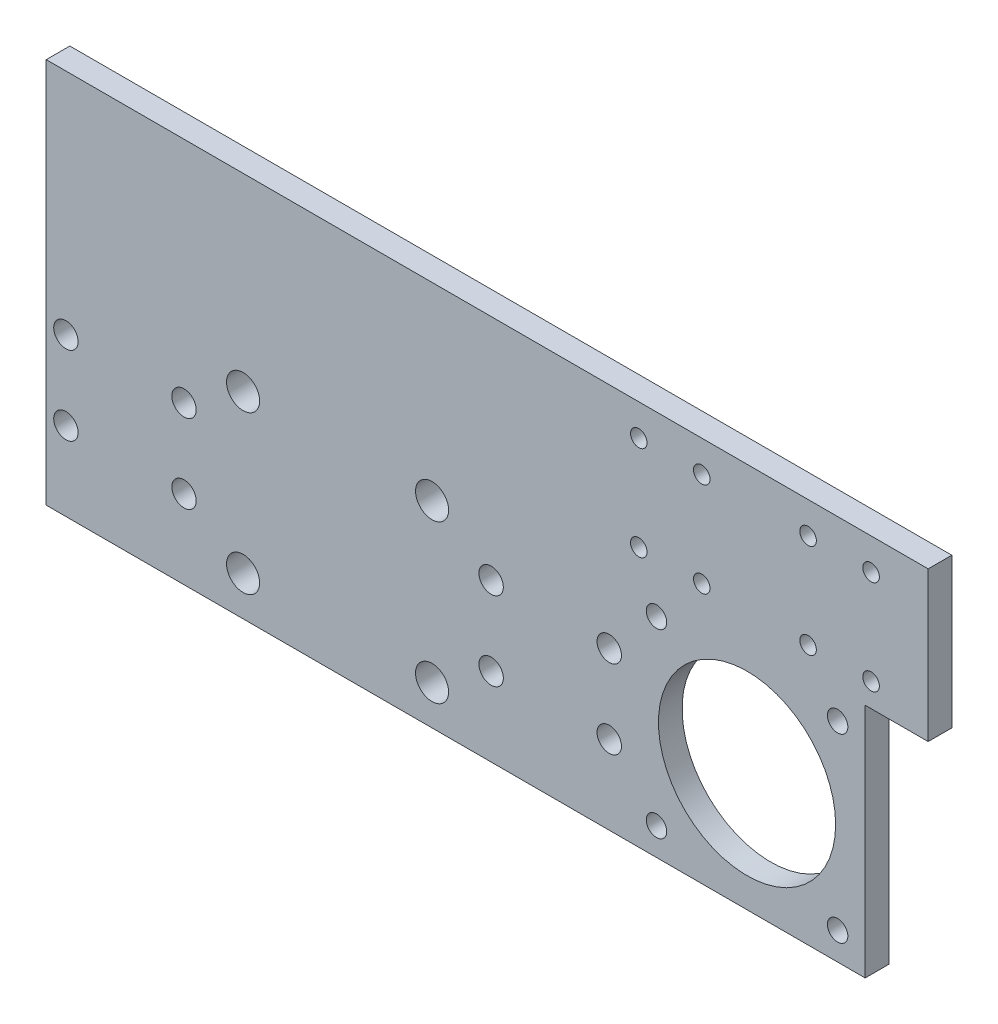
ISO-10303-21;
HEADER;
FILE_DESCRIPTION(('STEP AP214'),'2;1');
FILE_NAME('part.step','',(''),(''),'','','');
FILE_SCHEMA(('AUTOMOTIVE_DESIGN { 1 0 10303 214 1 1 1 1 }'));
ENDSEC;
DATA;
#1=APPLICATION_CONTEXT('core data for automotive mechanical design processes');
#2=APPLICATION_PROTOCOL_DEFINITION('international standard','automotive_design',2000,#1);
#3=PRODUCT_CONTEXT('',#1,'mechanical');
#4=PRODUCT('Part','Part','',(#3));
#5=PRODUCT_RELATED_PRODUCT_CATEGORY('part','',(#4));
#6=PRODUCT_DEFINITION_FORMATION('','',#4);
#7=PRODUCT_DEFINITION_CONTEXT('part definition',#1,'design');
#8=PRODUCT_DEFINITION('design','',#6,#7);
#9=PRODUCT_DEFINITION_SHAPE('','',#8);
#10=(LENGTH_UNIT() NAMED_UNIT(*) SI_UNIT(.MILLI.,.METRE.));
#11=(NAMED_UNIT(*) PLANE_ANGLE_UNIT() SI_UNIT($,.RADIAN.));
#12=(NAMED_UNIT(*) SI_UNIT($,.STERADIAN.) SOLID_ANGLE_UNIT());
#13=UNCERTAINTY_MEASURE_WITH_UNIT(LENGTH_MEASURE(1.E-05),#10,'distance_accuracy_value','');
#14=(GEOMETRIC_REPRESENTATION_CONTEXT(3) GLOBAL_UNCERTAINTY_ASSIGNED_CONTEXT((#13)) GLOBAL_UNIT_ASSIGNED_CONTEXT((#10,
#11,#12)) REPRESENTATION_CONTEXT('',''));
#15=CARTESIAN_POINT('',(0.,0.,0.));
#16=DIRECTION('',(0.,0.,1.));
#17=DIRECTION('',(1.,0.,0.));
#18=AXIS2_PLACEMENT_3D('',#15,#16,#17);
#19=CARTESIAN_POINT('',(-37.,15.,3.));
#20=DIRECTION('',(1.,0.,0.));
#21=DIRECTION('',(0.,1.,0.));
#22=AXIS2_PLACEMENT_3D('',#19,#20,#21);
#23=PLANE('',#22);
#24=DIRECTION('',(0.,-1.,0.));
#25=VECTOR('',#24,1.);
#26=CARTESIAN_POINT('',(-37.,15.,0.));
#27=LINE('',#26,#25);
#28=CARTESIAN_POINT('',(-37.,34.,0.));
#29=VERTEX_POINT('',#28);
#30=CARTESIAN_POINT('',(-37.,-15.,0.));
#31=VERTEX_POINT('',#30);
#32=EDGE_CURVE('E285',#29,#31,#27,.T.);
#33=ORIENTED_EDGE('',*,*,#32,.T.);
#34=DIRECTION('',(0.,0.,-1.));
#35=VECTOR('',#34,1.);
#36=CARTESIAN_POINT('',(-37.,-15.,3.));
#37=LINE('',#36,#35);
#38=CARTESIAN_POINT('',(-37.,-15.,3.));
#39=VERTEX_POINT('',#38);
#40=EDGE_CURVE('E11',#39,#31,#37,.T.);
#41=ORIENTED_EDGE('',*,*,#40,.F.);
#42=DIRECTION('',(0.,-1.,0.));
#43=VECTOR('',#42,1.);
#44=CARTESIAN_POINT('',(-37.,15.,3.));
#45=LINE('',#44,#43);
#46=CARTESIAN_POINT('',(-37.,34.,3.));
#47=VERTEX_POINT('',#46);
#48=EDGE_CURVE('E65',#47,#39,#45,.T.);
#49=ORIENTED_EDGE('',*,*,#48,.F.);
#50=DIRECTION('',(0.,0.,1.));
#51=VECTOR('',#50,1.);
#52=CARTESIAN_POINT('',(-37.,34.,0.));
#53=LINE('',#52,#51);
#54=EDGE_CURVE('E101',#29,#47,#53,.T.);
#55=ORIENTED_EDGE('',*,*,#54,.F.);
#56=EDGE_LOOP('',(#33,#41,#49,#55));
#57=FACE_BOUND('',#56,.T.);
#58=ADVANCED_FACE('F39',(#57),#23,.F.);
#59=CARTESIAN_POINT('',(-37.,-15.,3.));
#60=DIRECTION('',(0.,1.,0.));
#61=DIRECTION('',(0.,0.,1.));
#62=AXIS2_PLACEMENT_3D('',#59,#60,#61);
#63=PLANE('',#62);
#64=DIRECTION('',(1.,0.,0.));
#65=VECTOR('',#64,1.);
#66=CARTESIAN_POINT('',(-37.,-15.,0.));
#67=LINE('',#66,#65);
#68=CARTESIAN_POINT('',(67.,-15.,0.));
#69=VERTEX_POINT('',#68);
#70=EDGE_CURVE('E291',#31,#69,#67,.T.);
#71=ORIENTED_EDGE('',*,*,#70,.T.);
#72=DIRECTION('',(0.,0.,1.));
#73=VECTOR('',#72,1.);
#74=CARTESIAN_POINT('',(67.,-15.,0.));
#75=LINE('',#74,#73);
#76=CARTESIAN_POINT('',(67.,-15.,3.));
#77=VERTEX_POINT('',#76);
#78=EDGE_CURVE('E186',#69,#77,#75,.T.);
#79=ORIENTED_EDGE('',*,*,#78,.T.);
#80=DIRECTION('',(1.,0.,0.));
#81=VECTOR('',#80,1.);
#82=CARTESIAN_POINT('',(-37.,-15.,3.));
#83=LINE('',#82,#81);
#84=EDGE_CURVE('E48',#39,#77,#83,.T.);
#85=ORIENTED_EDGE('',*,*,#84,.F.);
#86=ORIENTED_EDGE('',*,*,#40,.T.);
#87=EDGE_LOOP('',(#71,#79,#85,#86));
#88=FACE_BOUND('',#87,.T.);
#89=ADVANCED_FACE('F336',(#88),#63,.F.);
#90=CARTESIAN_POINT('',(0.,0.,3.));
#91=DIRECTION('',(0.,0.,1.));
#92=DIRECTION('',(1.,0.,0.));
#93=AXIS2_PLACEMENT_3D('',#90,#91,#92);
#94=PLANE('',#93);
#95=CARTESIAN_POINT('',(38.25,30.,3.));
#96=DIRECTION('',(0.,0.,1.));
#97=DIRECTION('',(1.,0.,0.));
#98=AXIS2_PLACEMENT_3D('',#95,#96,#97);
#99=CIRCLE('',#98,1.05);
#100=CARTESIAN_POINT('',(39.3,30.,3.));
#101=VERTEX_POINT('',#100);
#102=EDGE_CURVE('E523',#101,#101,#99,.T.);
#103=ORIENTED_EDGE('',*,*,#102,.F.);
#104=EDGE_LOOP('',(#103));
#105=FACE_BOUND('',#104,.T.);
#106=CARTESIAN_POINT('',(38.25,18.,3.));
#107=DIRECTION('',(0.,0.,1.));
#108=DIRECTION('',(1.,0.,0.));
#109=AXIS2_PLACEMENT_3D('',#106,#107,#108);
#110=CIRCLE('',#109,1.05);
#111=CARTESIAN_POINT('',(39.3,18.,3.));
#112=VERTEX_POINT('',#111);
#113=EDGE_CURVE('E515',#112,#112,#110,.T.);
#114=ORIENTED_EDGE('',*,*,#113,.F.);
#115=EDGE_LOOP('',(#114));
#116=FACE_BOUND('',#115,.T.);
#117=CARTESIAN_POINT('',(46.25,18.,3.));
#118=DIRECTION('',(0.,0.,1.));
#119=DIRECTION('',(1.,0.,0.));
#120=AXIS2_PLACEMENT_3D('',#117,#118,#119);
#121=CIRCLE('',#120,1.05);
#122=CARTESIAN_POINT('',(47.3,18.,3.));
#123=VERTEX_POINT('',#122);
#124=EDGE_CURVE('E459',#123,#123,#121,.T.);
#125=ORIENTED_EDGE('',*,*,#124,.F.);
#126=EDGE_LOOP('',(#125));
#127=FACE_BOUND('',#126,.T.);
#128=CARTESIAN_POINT('',(46.25,30.,3.));
#129=DIRECTION('',(0.,0.,1.));
#130=DIRECTION('',(1.,0.,0.));
#131=AXIS2_PLACEMENT_3D('',#128,#129,#130);
#132=CIRCLE('',#131,1.05);
#133=CARTESIAN_POINT('',(47.3,30.,3.));
#134=VERTEX_POINT('',#133);
#135=EDGE_CURVE('E458',#134,#134,#132,.T.);
#136=ORIENTED_EDGE('',*,*,#135,.F.);
#137=EDGE_LOOP('',(#136));
#138=FACE_BOUND('',#137,.T.);
#139=ORIENTED_EDGE('',*,*,#48,.T.);
#140=ORIENTED_EDGE('',*,*,#84,.T.);
#141=DIRECTION('',(0.,1.,0.));
#142=VECTOR('',#141,1.);
#143=CARTESIAN_POINT('',(67.,15.,3.));
#144=LINE('',#143,#142);
#145=CARTESIAN_POINT('',(67.,15.,3.));
#146=VERTEX_POINT('',#145);
#147=EDGE_CURVE('E179',#77,#146,#144,.T.);
#148=ORIENTED_EDGE('',*,*,#147,.T.);
#149=DIRECTION('',(-1.,0.,0.));
#150=VECTOR('',#149,1.);
#151=CARTESIAN_POINT('',(67.,15.,3.));
#152=LINE('',#151,#150);
#153=CARTESIAN_POINT('',(75.,15.,3.));
#154=VERTEX_POINT('',#153);
#155=EDGE_CURVE('E115',#154,#146,#152,.T.);
#156=ORIENTED_EDGE('',*,*,#155,.F.);
#157=DIRECTION('',(0.,-1.,0.));
#158=VECTOR('',#157,1.);
#159=CARTESIAN_POINT('',(75.,34.,3.));
#160=LINE('',#159,#158);
#161=CARTESIAN_POINT('',(75.,34.,3.));
#162=VERTEX_POINT('',#161);
#163=EDGE_CURVE('E109',#162,#154,#160,.T.);
#164=ORIENTED_EDGE('',*,*,#163,.F.);
#165=DIRECTION('',(-1.,0.,0.));
#166=VECTOR('',#165,1.);
#167=CARTESIAN_POINT('',(-37.,34.,3.));
#168=LINE('',#167,#166);
#169=EDGE_CURVE('E95',#162,#47,#168,.T.);
#170=ORIENTED_EDGE('',*,*,#169,.T.);
#171=EDGE_LOOP('',(#139,#140,#148,#156,#164,#170));
#172=FACE_BOUND('',#171,.T.);
#173=CARTESIAN_POINT('',(51.9999999999998,0.,3.));
#174=DIRECTION('',(0.,0.,1.));
#175=DIRECTION('',(1.,0.,0.));
#176=AXIS2_PLACEMENT_3D('',#173,#174,#175);
#177=CIRCLE('',#176,11.25);
#178=CARTESIAN_POINT('',(63.2499999999998,0.,3.));
#179=VERTEX_POINT('',#178);
#180=EDGE_CURVE('E171',#179,#179,#177,.T.);
#181=ORIENTED_EDGE('',*,*,#180,.F.);
#182=EDGE_LOOP('',(#181));
#183=FACE_BOUND('',#182,.T.);
#184=CARTESIAN_POINT('',(40.4999999999998,11.5,3.));
#185=DIRECTION('',(0.,0.,1.));
#186=DIRECTION('',(1.,0.,0.));
#187=AXIS2_PLACEMENT_3D('',#184,#185,#186);
#188=CIRCLE('',#187,1.3);
#189=CARTESIAN_POINT('',(41.7999999999998,11.5,3.));
#190=VERTEX_POINT('',#189);
#191=EDGE_CURVE('E163',#190,#190,#188,.T.);
#192=ORIENTED_EDGE('',*,*,#191,.F.);
#193=EDGE_LOOP('',(#192));
#194=FACE_BOUND('',#193,.T.);
#195=CARTESIAN_POINT('',(63.4999999999998,11.5,3.));
#196=DIRECTION('',(0.,0.,1.));
#197=DIRECTION('',(1.,0.,0.));
#198=AXIS2_PLACEMENT_3D('',#195,#196,#197);
#199=CIRCLE('',#198,1.29999999999999);
#200=CARTESIAN_POINT('',(64.7999999999998,11.5,3.));
#201=VERTEX_POINT('',#200);
#202=EDGE_CURVE('E155',#201,#201,#199,.T.);
#203=ORIENTED_EDGE('',*,*,#202,.F.);
#204=EDGE_LOOP('',(#203));
#205=FACE_BOUND('',#204,.T.);
#206=CARTESIAN_POINT('',(40.4999999999998,-11.5,3.));
#207=DIRECTION('',(0.,0.,1.));
#208=DIRECTION('',(1.,0.,0.));
#209=AXIS2_PLACEMENT_3D('',#206,#207,#208);
#210=CIRCLE('',#209,1.3);
#211=CARTESIAN_POINT('',(41.7999999999998,-11.5,3.));
#212=VERTEX_POINT('',#211);
#213=EDGE_CURVE('E147',#212,#212,#210,.T.);
#214=ORIENTED_EDGE('',*,*,#213,.F.);
#215=EDGE_LOOP('',(#214));
#216=FACE_BOUND('',#215,.T.);
#217=CARTESIAN_POINT('',(63.4999999999998,-11.5,3.));
#218=DIRECTION('',(0.,0.,1.));
#219=DIRECTION('',(1.,0.,0.));
#220=AXIS2_PLACEMENT_3D('',#217,#218,#219);
#221=CIRCLE('',#220,1.29999999999999);
#222=CARTESIAN_POINT('',(64.7999999999998,-11.5,3.));
#223=VERTEX_POINT('',#222);
#224=EDGE_CURVE('E142',#223,#223,#221,.T.);
#225=ORIENTED_EDGE('',*,*,#224,.F.);
#226=EDGE_LOOP('',(#225));
#227=FACE_BOUND('',#226,.T.);
#228=CARTESIAN_POINT('',(34.5,5.00000000000001,3.));
#229=DIRECTION('',(0.,0.,-1.));
#230=DIRECTION('',(-1.,0.,0.));
#231=AXIS2_PLACEMENT_3D('',#228,#229,#230);
#232=CIRCLE('',#231,1.55);
#233=CARTESIAN_POINT('',(32.95,5.00000000000001,3.));
#234=VERTEX_POINT('',#233);
#235=EDGE_CURVE('E281',#234,#234,#232,.T.);
#236=ORIENTED_EDGE('',*,*,#235,.T.);
#237=EDGE_LOOP('',(#236));
#238=FACE_BOUND('',#237,.T.);
#239=CARTESIAN_POINT('',(-34.5,-4.99999999999996,3.));
#240=DIRECTION('',(0.,0.,-1.));
#241=DIRECTION('',(-1.,0.,0.));
#242=AXIS2_PLACEMENT_3D('',#239,#240,#241);
#243=CIRCLE('',#242,1.55);
#244=CARTESIAN_POINT('',(-36.05,-4.99999999999996,3.));
#245=VERTEX_POINT('',#244);
#246=EDGE_CURVE('E201',#245,#245,#243,.T.);
#247=ORIENTED_EDGE('',*,*,#246,.T.);
#248=EDGE_LOOP('',(#247));
#249=FACE_BOUND('',#248,.T.);
#250=CARTESIAN_POINT('',(-19.5,5.00000000000004,3.));
#251=DIRECTION('',(0.,0.,-1.));
#252=DIRECTION('',(-1.,0.,0.));
#253=AXIS2_PLACEMENT_3D('',#250,#251,#252);
#254=CIRCLE('',#253,1.55);
#255=CARTESIAN_POINT('',(-21.05,5.00000000000004,3.));
#256=VERTEX_POINT('',#255);
#257=EDGE_CURVE('E210',#256,#256,#254,.T.);
#258=ORIENTED_EDGE('',*,*,#257,.T.);
#259=EDGE_LOOP('',(#258));
#260=FACE_BOUND('',#259,.T.);
#261=CARTESIAN_POINT('',(-19.5,-4.99999999999996,3.));
#262=DIRECTION('',(0.,0.,-1.));
#263=DIRECTION('',(-1.,0.,0.));
#264=AXIS2_PLACEMENT_3D('',#261,#262,#263);
#265=CIRCLE('',#264,1.55);
#266=CARTESIAN_POINT('',(-21.05,-4.99999999999996,3.));
#267=VERTEX_POINT('',#266);
#268=EDGE_CURVE('E193',#267,#267,#265,.T.);
#269=ORIENTED_EDGE('',*,*,#268,.T.);
#270=EDGE_LOOP('',(#269));
#271=FACE_BOUND('',#270,.T.);
#272=CARTESIAN_POINT('',(12.,10.,3.));
#273=DIRECTION('',(0.,0.,-1.));
#274=DIRECTION('',(-1.,0.,0.));
#275=AXIS2_PLACEMENT_3D('',#272,#273,#274);
#276=CIRCLE('',#275,2.1);
#277=CARTESIAN_POINT('',(9.90000000000003,10.,3.));
#278=VERTEX_POINT('',#277);
#279=EDGE_CURVE('E258',#278,#278,#276,.T.);
#280=ORIENTED_EDGE('',*,*,#279,.T.);
#281=EDGE_LOOP('',(#280));
#282=FACE_BOUND('',#281,.T.);
#283=CARTESIAN_POINT('',(19.5,-4.99999999999999,3.));
#284=DIRECTION('',(0.,0.,-1.));
#285=DIRECTION('',(-1.,0.,0.));
#286=AXIS2_PLACEMENT_3D('',#283,#284,#285);
#287=CIRCLE('',#286,1.55);
#288=CARTESIAN_POINT('',(17.95,-4.99999999999999,3.));
#289=VERTEX_POINT('',#288);
#290=EDGE_CURVE('E249',#289,#289,#287,.T.);
#291=ORIENTED_EDGE('',*,*,#290,.T.);
#292=EDGE_LOOP('',(#291));
#293=FACE_BOUND('',#292,.T.);
#294=CARTESIAN_POINT('',(19.5,5.00000000000001,3.));
#295=DIRECTION('',(0.,0.,-1.));
#296=DIRECTION('',(-1.,0.,0.));
#297=AXIS2_PLACEMENT_3D('',#294,#295,#296);
#298=CIRCLE('',#297,1.55);
#299=CARTESIAN_POINT('',(17.95,5.00000000000001,3.));
#300=VERTEX_POINT('',#299);
#301=EDGE_CURVE('E274',#300,#300,#298,.T.);
#302=ORIENTED_EDGE('',*,*,#301,.T.);
#303=EDGE_LOOP('',(#302));
#304=FACE_BOUND('',#303,.T.);
#305=CARTESIAN_POINT('',(34.5,-4.99999999999999,3.));
#306=DIRECTION('',(0.,0.,-1.));
#307=DIRECTION('',(-1.,0.,0.));
#308=AXIS2_PLACEMENT_3D('',#305,#306,#307);
#309=CIRCLE('',#308,1.55);
#310=CARTESIAN_POINT('',(32.95,-4.99999999999999,3.));
#311=VERTEX_POINT('',#310);
#312=EDGE_CURVE('E265',#311,#311,#309,.T.);
#313=ORIENTED_EDGE('',*,*,#312,.T.);
#314=EDGE_LOOP('',(#313));
#315=FACE_BOUND('',#314,.T.);
#316=CARTESIAN_POINT('',(-34.5,5.00000000000004,3.));
#317=DIRECTION('',(0.,0.,-1.));
#318=DIRECTION('',(-1.,0.,0.));
#319=AXIS2_PLACEMENT_3D('',#316,#317,#318);
#320=CIRCLE('',#319,1.55);
#321=CARTESIAN_POINT('',(-36.05,5.00000000000004,3.));
#322=VERTEX_POINT('',#321);
#323=EDGE_CURVE('E226',#322,#322,#320,.T.);
#324=ORIENTED_EDGE('',*,*,#323,.T.);
#325=EDGE_LOOP('',(#324));
#326=FACE_BOUND('',#325,.T.);
#327=CARTESIAN_POINT('',(-12.,-9.99999999999997,3.));
#328=DIRECTION('',(0.,0.,-1.));
#329=DIRECTION('',(-1.,0.,0.));
#330=AXIS2_PLACEMENT_3D('',#327,#328,#329);
#331=CIRCLE('',#330,2.1);
#332=CARTESIAN_POINT('',(-14.1,-9.99999999999997,3.));
#333=VERTEX_POINT('',#332);
#334=EDGE_CURVE('E217',#333,#333,#331,.T.);
#335=ORIENTED_EDGE('',*,*,#334,.T.);
#336=EDGE_LOOP('',(#335));
#337=FACE_BOUND('',#336,.T.);
#338=CARTESIAN_POINT('',(12.,-9.99999999999997,3.));
#339=DIRECTION('',(0.,0.,-1.));
#340=DIRECTION('',(-1.,0.,0.));
#341=AXIS2_PLACEMENT_3D('',#338,#339,#340);
#342=CIRCLE('',#341,2.1);
#343=CARTESIAN_POINT('',(9.90000000000003,-9.99999999999997,3.));
#344=VERTEX_POINT('',#343);
#345=EDGE_CURVE('E242',#344,#344,#342,.T.);
#346=ORIENTED_EDGE('',*,*,#345,.T.);
#347=EDGE_LOOP('',(#346));
#348=FACE_BOUND('',#347,.T.);
#349=CARTESIAN_POINT('',(-12.,10.,3.));
#350=DIRECTION('',(0.,0.,-1.));
#351=DIRECTION('',(-1.,0.,0.));
#352=AXIS2_PLACEMENT_3D('',#349,#350,#351);
#353=CIRCLE('',#352,2.1);
#354=CARTESIAN_POINT('',(-14.1,10.,3.));
#355=VERTEX_POINT('',#354);
#356=EDGE_CURVE('E233',#355,#355,#353,.T.);
#357=ORIENTED_EDGE('',*,*,#356,.T.);
#358=EDGE_LOOP('',(#357));
#359=FACE_BOUND('',#358,.T.);
#360=CARTESIAN_POINT('',(59.75,30.,3.));
#361=DIRECTION('',(0.,0.,1.));
#362=DIRECTION('',(1.,0.,0.));
#363=AXIS2_PLACEMENT_3D('',#360,#361,#362);
#364=CIRCLE('',#363,1.05);
#365=CARTESIAN_POINT('',(60.8,30.,3.));
#366=VERTEX_POINT('',#365);
#367=EDGE_CURVE('E129',#366,#366,#364,.T.);
#368=ORIENTED_EDGE('',*,*,#367,.F.);
#369=EDGE_LOOP('',(#368));
#370=FACE_BOUND('',#369,.T.);
#371=CARTESIAN_POINT('',(67.75,18.,3.));
#372=DIRECTION('',(0.,0.,1.));
#373=DIRECTION('',(1.,0.,0.));
#374=AXIS2_PLACEMENT_3D('',#371,#372,#373);
#375=CIRCLE('',#374,1.05000000000001);
#376=CARTESIAN_POINT('',(68.8,18.,3.));
#377=VERTEX_POINT('',#376);
#378=EDGE_CURVE('E464',#377,#377,#375,.T.);
#379=ORIENTED_EDGE('',*,*,#378,.F.);
#380=EDGE_LOOP('',(#379));
#381=FACE_BOUND('',#380,.T.);
#382=CARTESIAN_POINT('',(59.75,18.,3.));
#383=DIRECTION('',(0.,0.,1.));
#384=DIRECTION('',(1.,0.,0.));
#385=AXIS2_PLACEMENT_3D('',#382,#383,#384);
#386=CIRCLE('',#385,1.05);
#387=CARTESIAN_POINT('',(60.8,18.,3.));
#388=VERTEX_POINT('',#387);
#389=EDGE_CURVE('E473',#388,#388,#386,.T.);
#390=ORIENTED_EDGE('',*,*,#389,.F.);
#391=EDGE_LOOP('',(#390));
#392=FACE_BOUND('',#391,.T.);
#393=CARTESIAN_POINT('',(67.75,30.,3.));
#394=DIRECTION('',(0.,0.,1.));
#395=DIRECTION('',(1.,0.,0.));
#396=AXIS2_PLACEMENT_3D('',#393,#394,#395);
#397=CIRCLE('',#396,1.05000000000001);
#398=CARTESIAN_POINT('',(68.8,30.,3.));
#399=VERTEX_POINT('',#398);
#400=EDGE_CURVE('E474',#399,#399,#397,.T.);
#401=ORIENTED_EDGE('',*,*,#400,.F.);
#402=EDGE_LOOP('',(#401));
#403=FACE_BOUND('',#402,.T.);
#404=ADVANCED_FACE('F117',(#105,#116,#127,#138,#172,#183,#194,#205,#216,#227,#238,#249,#260,
#271,#282,#293,#304,#315,#326,#337,#348,#359,#370,#381,#392,#403),#94,.T.);
#405=CARTESIAN_POINT('',(0.,0.,0.));
#406=DIRECTION('',(0.,0.,1.));
#407=DIRECTION('',(1.,0.,0.));
#408=AXIS2_PLACEMENT_3D('',#405,#406,#407);
#409=PLANE('',#408);
#410=CARTESIAN_POINT('',(38.25,30.,0.));
#411=DIRECTION('',(0.,0.,1.));
#412=DIRECTION('',(1.,0.,0.));
#413=AXIS2_PLACEMENT_3D('',#410,#411,#412);
#414=CIRCLE('',#413,1.05);
#415=CARTESIAN_POINT('',(39.3,30.,0.));
#416=VERTEX_POINT('',#415);
#417=EDGE_CURVE('E444',#416,#416,#414,.T.);
#418=ORIENTED_EDGE('',*,*,#417,.T.);
#419=EDGE_LOOP('',(#418));
#420=FACE_BOUND('',#419,.T.);
#421=CARTESIAN_POINT('',(38.25,18.,0.));
#422=DIRECTION('',(0.,0.,1.));
#423=DIRECTION('',(1.,0.,0.));
#424=AXIS2_PLACEMENT_3D('',#421,#422,#423);
#425=CIRCLE('',#424,1.05);
#426=CARTESIAN_POINT('',(39.3,18.,0.));
#427=VERTEX_POINT('',#426);
#428=EDGE_CURVE('E448',#427,#427,#425,.T.);
#429=ORIENTED_EDGE('',*,*,#428,.T.);
#430=EDGE_LOOP('',(#429));
#431=FACE_BOUND('',#430,.T.);
#432=CARTESIAN_POINT('',(46.25,18.,0.));
#433=DIRECTION('',(0.,0.,1.));
#434=DIRECTION('',(1.,0.,0.));
#435=AXIS2_PLACEMENT_3D('',#432,#433,#434);
#436=CIRCLE('',#435,1.05);
#437=CARTESIAN_POINT('',(47.3,18.,0.));
#438=VERTEX_POINT('',#437);
#439=EDGE_CURVE('E452',#438,#438,#436,.T.);
#440=ORIENTED_EDGE('',*,*,#439,.T.);
#441=EDGE_LOOP('',(#440));
#442=FACE_BOUND('',#441,.T.);
#443=CARTESIAN_POINT('',(46.25,30.,0.));
#444=DIRECTION('',(0.,0.,1.));
#445=DIRECTION('',(1.,0.,0.));
#446=AXIS2_PLACEMENT_3D('',#443,#444,#445);
#447=CIRCLE('',#446,1.05);
#448=CARTESIAN_POINT('',(47.3,30.,0.));
#449=VERTEX_POINT('',#448);
#450=EDGE_CURVE('E455',#449,#449,#447,.T.);
#451=ORIENTED_EDGE('',*,*,#450,.T.);
#452=EDGE_LOOP('',(#451));
#453=FACE_BOUND('',#452,.T.);
#454=ORIENTED_EDGE('',*,*,#70,.F.);
#455=ORIENTED_EDGE('',*,*,#32,.F.);
#456=DIRECTION('',(-1.,0.,0.));
#457=VECTOR('',#456,1.);
#458=CARTESIAN_POINT('',(-37.,34.,0.));
#459=LINE('',#458,#457);
#460=CARTESIAN_POINT('',(75.,34.,0.));
#461=VERTEX_POINT('',#460);
#462=EDGE_CURVE('E104',#461,#29,#459,.T.);
#463=ORIENTED_EDGE('',*,*,#462,.F.);
#464=DIRECTION('',(0.,-1.,0.));
#465=VECTOR('',#464,1.);
#466=CARTESIAN_POINT('',(75.,34.,0.));
#467=LINE('',#466,#465);
#468=CARTESIAN_POINT('',(75.,15.,0.));
#469=VERTEX_POINT('',#468);
#470=EDGE_CURVE('E112',#461,#469,#467,.T.);
#471=ORIENTED_EDGE('',*,*,#470,.T.);
#472=DIRECTION('',(-1.,0.,0.));
#473=VECTOR('',#472,1.);
#474=CARTESIAN_POINT('',(67.,15.,0.));
#475=LINE('',#474,#473);
#476=CARTESIAN_POINT('',(67.,15.,0.));
#477=VERTEX_POINT('',#476);
#478=EDGE_CURVE('E121',#469,#477,#475,.T.);
#479=ORIENTED_EDGE('',*,*,#478,.T.);
#480=DIRECTION('',(0.,1.,0.));
#481=VECTOR('',#480,1.);
#482=CARTESIAN_POINT('',(67.,15.,0.));
#483=LINE('',#482,#481);
#484=EDGE_CURVE('E183',#69,#477,#483,.T.);
#485=ORIENTED_EDGE('',*,*,#484,.F.);
#486=EDGE_LOOP('',(#454,#455,#463,#471,#479,#485));
#487=FACE_BOUND('',#486,.T.);
#488=CARTESIAN_POINT('',(51.9999999999998,0.,0.));
#489=DIRECTION('',(0.,0.,1.));
#490=DIRECTION('',(1.,0.,0.));
#491=AXIS2_PLACEMENT_3D('',#488,#489,#490);
#492=CIRCLE('',#491,11.25);
#493=CARTESIAN_POINT('',(63.2499999999998,0.,0.));
#494=VERTEX_POINT('',#493);
#495=EDGE_CURVE('E175',#494,#494,#492,.T.);
#496=ORIENTED_EDGE('',*,*,#495,.T.);
#497=EDGE_LOOP('',(#496));
#498=FACE_BOUND('',#497,.T.);
#499=CARTESIAN_POINT('',(40.4999999999998,11.5,0.));
#500=DIRECTION('',(0.,0.,1.));
#501=DIRECTION('',(1.,0.,0.));
#502=AXIS2_PLACEMENT_3D('',#499,#500,#501);
#503=CIRCLE('',#502,1.3);
#504=CARTESIAN_POINT('',(41.7999999999998,11.5,0.));
#505=VERTEX_POINT('',#504);
#506=EDGE_CURVE('E167',#505,#505,#503,.T.);
#507=ORIENTED_EDGE('',*,*,#506,.T.);
#508=EDGE_LOOP('',(#507));
#509=FACE_BOUND('',#508,.T.);
#510=CARTESIAN_POINT('',(63.4999999999998,11.5,0.));
#511=DIRECTION('',(0.,0.,1.));
#512=DIRECTION('',(1.,0.,0.));
#513=AXIS2_PLACEMENT_3D('',#510,#511,#512);
#514=CIRCLE('',#513,1.29999999999999);
#515=CARTESIAN_POINT('',(64.7999999999998,11.5,0.));
#516=VERTEX_POINT('',#515);
#517=EDGE_CURVE('E159',#516,#516,#514,.T.);
#518=ORIENTED_EDGE('',*,*,#517,.T.);
#519=EDGE_LOOP('',(#518));
#520=FACE_BOUND('',#519,.T.);
#521=CARTESIAN_POINT('',(40.4999999999998,-11.5,0.));
#522=DIRECTION('',(0.,0.,1.));
#523=DIRECTION('',(1.,0.,0.));
#524=AXIS2_PLACEMENT_3D('',#521,#522,#523);
#525=CIRCLE('',#524,1.3);
#526=CARTESIAN_POINT('',(41.7999999999998,-11.5,0.));
#527=VERTEX_POINT('',#526);
#528=EDGE_CURVE('E151',#527,#527,#525,.T.);
#529=ORIENTED_EDGE('',*,*,#528,.T.);
#530=EDGE_LOOP('',(#529));
#531=FACE_BOUND('',#530,.T.);
#532=CARTESIAN_POINT('',(63.4999999999998,-11.5,0.));
#533=DIRECTION('',(0.,0.,1.));
#534=DIRECTION('',(1.,0.,0.));
#535=AXIS2_PLACEMENT_3D('',#532,#533,#534);
#536=CIRCLE('',#535,1.29999999999999);
#537=CARTESIAN_POINT('',(64.7999999999998,-11.5,0.));
#538=VERTEX_POINT('',#537);
#539=EDGE_CURVE('E143',#538,#538,#536,.T.);
#540=ORIENTED_EDGE('',*,*,#539,.T.);
#541=EDGE_LOOP('',(#540));
#542=FACE_BOUND('',#541,.T.);
#543=CARTESIAN_POINT('',(34.5,5.00000000000001,0.));
#544=DIRECTION('',(0.,0.,-1.));
#545=DIRECTION('',(-1.,0.,0.));
#546=AXIS2_PLACEMENT_3D('',#543,#544,#545);
#547=CIRCLE('',#546,1.55);
#548=CARTESIAN_POINT('',(32.95,5.00000000000001,0.));
#549=VERTEX_POINT('',#548);
#550=EDGE_CURVE('E269',#549,#549,#547,.T.);
#551=ORIENTED_EDGE('',*,*,#550,.F.);
#552=EDGE_LOOP('',(#551));
#553=FACE_BOUND('',#552,.T.);
#554=CARTESIAN_POINT('',(-34.5,-4.99999999999996,0.));
#555=DIRECTION('',(0.,0.,-1.));
#556=DIRECTION('',(-1.,0.,0.));
#557=AXIS2_PLACEMENT_3D('',#554,#555,#556);
#558=CIRCLE('',#557,1.55);
#559=CARTESIAN_POINT('',(-36.05,-4.99999999999996,0.));
#560=VERTEX_POINT('',#559);
#561=EDGE_CURVE('E206',#560,#560,#558,.T.);
#562=ORIENTED_EDGE('',*,*,#561,.F.);
#563=EDGE_LOOP('',(#562));
#564=FACE_BOUND('',#563,.T.);
#565=CARTESIAN_POINT('',(-19.5,5.00000000000004,0.));
#566=DIRECTION('',(0.,0.,-1.));
#567=DIRECTION('',(-1.,0.,0.));
#568=AXIS2_PLACEMENT_3D('',#565,#566,#567);
#569=CIRCLE('',#568,1.55);
#570=CARTESIAN_POINT('',(-21.05,5.00000000000004,0.));
#571=VERTEX_POINT('',#570);
#572=EDGE_CURVE('E197',#571,#571,#569,.T.);
#573=ORIENTED_EDGE('',*,*,#572,.F.);
#574=EDGE_LOOP('',(#573));
#575=FACE_BOUND('',#574,.T.);
#576=CARTESIAN_POINT('',(-19.5,-4.99999999999996,0.));
#577=DIRECTION('',(0.,0.,-1.));
#578=DIRECTION('',(-1.,0.,0.));
#579=AXIS2_PLACEMENT_3D('',#576,#577,#578);
#580=CIRCLE('',#579,1.55);
#581=CARTESIAN_POINT('',(-21.05,-4.99999999999996,0.));
#582=VERTEX_POINT('',#581);
#583=EDGE_CURVE('E192',#582,#582,#580,.T.);
#584=ORIENTED_EDGE('',*,*,#583,.F.);
#585=EDGE_LOOP('',(#584));
#586=FACE_BOUND('',#585,.T.);
#587=CARTESIAN_POINT('',(12.,10.,0.));
#588=DIRECTION('',(0.,0.,-1.));
#589=DIRECTION('',(-1.,0.,0.));
#590=AXIS2_PLACEMENT_3D('',#587,#588,#589);
#591=CIRCLE('',#590,2.1);
#592=CARTESIAN_POINT('',(9.90000000000003,10.,0.));
#593=VERTEX_POINT('',#592);
#594=EDGE_CURVE('E237',#593,#593,#591,.T.);
#595=ORIENTED_EDGE('',*,*,#594,.F.);
#596=EDGE_LOOP('',(#595));
#597=FACE_BOUND('',#596,.T.);
#598=CARTESIAN_POINT('',(19.5,-4.99999999999999,0.));
#599=DIRECTION('',(0.,0.,-1.));
#600=DIRECTION('',(-1.,0.,0.));
#601=AXIS2_PLACEMENT_3D('',#598,#599,#600);
#602=CIRCLE('',#601,1.55);
#603=CARTESIAN_POINT('',(17.95,-4.99999999999999,0.));
#604=VERTEX_POINT('',#603);
#605=EDGE_CURVE('E254',#604,#604,#602,.T.);
#606=ORIENTED_EDGE('',*,*,#605,.F.);
#607=EDGE_LOOP('',(#606));
#608=FACE_BOUND('',#607,.T.);
#609=CARTESIAN_POINT('',(19.5,5.00000000000001,0.));
#610=DIRECTION('',(0.,0.,-1.));
#611=DIRECTION('',(-1.,0.,0.));
#612=AXIS2_PLACEMENT_3D('',#609,#610,#611);
#613=CIRCLE('',#612,1.55);
#614=CARTESIAN_POINT('',(17.95,5.00000000000001,0.));
#615=VERTEX_POINT('',#614);
#616=EDGE_CURVE('E253',#615,#615,#613,.T.);
#617=ORIENTED_EDGE('',*,*,#616,.F.);
#618=EDGE_LOOP('',(#617));
#619=FACE_BOUND('',#618,.T.);
#620=CARTESIAN_POINT('',(34.5,-4.99999999999999,0.));
#621=DIRECTION('',(0.,0.,-1.));
#622=DIRECTION('',(-1.,0.,0.));
#623=AXIS2_PLACEMENT_3D('',#620,#621,#622);
#624=CIRCLE('',#623,1.55);
#625=CARTESIAN_POINT('',(32.95,-4.99999999999999,0.));
#626=VERTEX_POINT('',#625);
#627=EDGE_CURVE('E270',#626,#626,#624,.T.);
#628=ORIENTED_EDGE('',*,*,#627,.F.);
#629=EDGE_LOOP('',(#628));
#630=FACE_BOUND('',#629,.T.);
#631=CARTESIAN_POINT('',(-34.5,5.00000000000004,0.));
#632=DIRECTION('',(0.,0.,-1.));
#633=DIRECTION('',(-1.,0.,0.));
#634=AXIS2_PLACEMENT_3D('',#631,#632,#633);
#635=CIRCLE('',#634,1.55);
#636=CARTESIAN_POINT('',(-36.05,5.00000000000004,0.));
#637=VERTEX_POINT('',#636);
#638=EDGE_CURVE('E205',#637,#637,#635,.T.);
#639=ORIENTED_EDGE('',*,*,#638,.F.);
#640=EDGE_LOOP('',(#639));
#641=FACE_BOUND('',#640,.T.);
#642=CARTESIAN_POINT('',(-12.,-9.99999999999997,0.));
#643=DIRECTION('',(0.,0.,-1.));
#644=DIRECTION('',(-1.,0.,0.));
#645=AXIS2_PLACEMENT_3D('',#642,#643,#644);
#646=CIRCLE('',#645,2.1);
#647=CARTESIAN_POINT('',(-14.1,-9.99999999999997,0.));
#648=VERTEX_POINT('',#647);
#649=EDGE_CURVE('E222',#648,#648,#646,.T.);
#650=ORIENTED_EDGE('',*,*,#649,.F.);
#651=EDGE_LOOP('',(#650));
#652=FACE_BOUND('',#651,.T.);
#653=CARTESIAN_POINT('',(12.,-9.99999999999997,0.));
#654=DIRECTION('',(0.,0.,-1.));
#655=DIRECTION('',(-1.,0.,0.));
#656=AXIS2_PLACEMENT_3D('',#653,#654,#655);
#657=CIRCLE('',#656,2.1);
#658=CARTESIAN_POINT('',(9.90000000000003,-9.99999999999997,0.));
#659=VERTEX_POINT('',#658);
#660=EDGE_CURVE('E221',#659,#659,#657,.T.);
#661=ORIENTED_EDGE('',*,*,#660,.F.);
#662=EDGE_LOOP('',(#661));
#663=FACE_BOUND('',#662,.T.);
#664=CARTESIAN_POINT('',(-12.,10.,0.));
#665=DIRECTION('',(0.,0.,-1.));
#666=DIRECTION('',(-1.,0.,0.));
#667=AXIS2_PLACEMENT_3D('',#664,#665,#666);
#668=CIRCLE('',#667,2.1);
#669=CARTESIAN_POINT('',(-14.1,10.,0.));
#670=VERTEX_POINT('',#669);
#671=EDGE_CURVE('E238',#670,#670,#668,.T.);
#672=ORIENTED_EDGE('',*,*,#671,.F.);
#673=EDGE_LOOP('',(#672));
#674=FACE_BOUND('',#673,.T.);
#675=CARTESIAN_POINT('',(59.75,30.,0.));
#676=DIRECTION('',(0.,0.,1.));
#677=DIRECTION('',(1.,0.,0.));
#678=AXIS2_PLACEMENT_3D('',#675,#676,#677);
#679=CIRCLE('',#678,1.05);
#680=CARTESIAN_POINT('',(60.8,30.,0.));
#681=VERTEX_POINT('',#680);
#682=EDGE_CURVE('E298',#681,#681,#679,.T.);
#683=ORIENTED_EDGE('',*,*,#682,.T.);
#684=EDGE_LOOP('',(#683));
#685=FACE_BOUND('',#684,.T.);
#686=CARTESIAN_POINT('',(67.75,18.,0.));
#687=DIRECTION('',(0.,0.,1.));
#688=DIRECTION('',(1.,0.,0.));
#689=AXIS2_PLACEMENT_3D('',#686,#687,#688);
#690=CIRCLE('',#689,1.05000000000001);
#691=CARTESIAN_POINT('',(68.8,18.,0.));
#692=VERTEX_POINT('',#691);
#693=EDGE_CURVE('E302',#692,#692,#690,.T.);
#694=ORIENTED_EDGE('',*,*,#693,.T.);
#695=EDGE_LOOP('',(#694));
#696=FACE_BOUND('',#695,.T.);
#697=CARTESIAN_POINT('',(59.75,18.,0.));
#698=DIRECTION('',(0.,0.,1.));
#699=DIRECTION('',(1.,0.,0.));
#700=AXIS2_PLACEMENT_3D('',#697,#698,#699);
#701=CIRCLE('',#700,1.05);
#702=CARTESIAN_POINT('',(60.8,18.,0.));
#703=VERTEX_POINT('',#702);
#704=EDGE_CURVE('E305',#703,#703,#701,.T.);
#705=ORIENTED_EDGE('',*,*,#704,.T.);
#706=EDGE_LOOP('',(#705));
#707=FACE_BOUND('',#706,.T.);
#708=CARTESIAN_POINT('',(67.75,30.,0.));
#709=DIRECTION('',(0.,0.,1.));
#710=DIRECTION('',(1.,0.,0.));
#711=AXIS2_PLACEMENT_3D('',#708,#709,#710);
#712=CIRCLE('',#711,1.05000000000001);
#713=CARTESIAN_POINT('',(68.8,30.,0.));
#714=VERTEX_POINT('',#713);
#715=EDGE_CURVE('E42',#714,#714,#712,.T.);
#716=ORIENTED_EDGE('',*,*,#715,.T.);
#717=EDGE_LOOP('',(#716));
#718=FACE_BOUND('',#717,.T.);
#719=ADVANCED_FACE('F314',(#420,#431,#442,#453,#487,#498,#509,#520,#531,#542,#553,#564,#575,
#586,#597,#608,#619,#630,#641,#652,#663,#674,#685,#696,#707,#718),#409,.F.);
#720=CARTESIAN_POINT('',(34.5,5.00000000000001,3.));
#721=DIRECTION('',(0.,0.,-1.));
#722=DIRECTION('',(-1.,0.,0.));
#723=AXIS2_PLACEMENT_3D('',#720,#721,#722);
#724=CYLINDRICAL_SURFACE('',#723,1.55);
#725=ORIENTED_EDGE('',*,*,#235,.F.);
#726=EDGE_LOOP('',(#725));
#727=FACE_BOUND('',#726,.T.);
#728=ORIENTED_EDGE('',*,*,#550,.T.);
#729=EDGE_LOOP('',(#728));
#730=FACE_BOUND('',#729,.T.);
#731=ADVANCED_FACE('F397',(#727,#730),#724,.F.);
#732=CARTESIAN_POINT('',(-34.5,-4.99999999999996,3.));
#733=DIRECTION('',(0.,0.,-1.));
#734=DIRECTION('',(-1.,0.,0.));
#735=AXIS2_PLACEMENT_3D('',#732,#733,#734);
#736=CYLINDRICAL_SURFACE('',#735,1.55);
#737=ORIENTED_EDGE('',*,*,#246,.F.);
#738=EDGE_LOOP('',(#737));
#739=FACE_BOUND('',#738,.T.);
#740=ORIENTED_EDGE('',*,*,#561,.T.);
#741=EDGE_LOOP('',(#740));
#742=FACE_BOUND('',#741,.T.);
#743=ADVANCED_FACE('F394',(#739,#742),#736,.F.);
#744=CARTESIAN_POINT('',(-19.5,5.00000000000004,3.));
#745=DIRECTION('',(0.,0.,-1.));
#746=DIRECTION('',(-1.,0.,0.));
#747=AXIS2_PLACEMENT_3D('',#744,#745,#746);
#748=CYLINDRICAL_SURFACE('',#747,1.55);
#749=ORIENTED_EDGE('',*,*,#257,.F.);
#750=EDGE_LOOP('',(#749));
#751=FACE_BOUND('',#750,.T.);
#752=ORIENTED_EDGE('',*,*,#572,.T.);
#753=EDGE_LOOP('',(#752));
#754=FACE_BOUND('',#753,.T.);
#755=ADVANCED_FACE('F392',(#751,#754),#748,.F.);
#756=CARTESIAN_POINT('',(-19.5,-4.99999999999996,3.));
#757=DIRECTION('',(0.,0.,-1.));
#758=DIRECTION('',(-1.,0.,0.));
#759=AXIS2_PLACEMENT_3D('',#756,#757,#758);
#760=CYLINDRICAL_SURFACE('',#759,1.55);
#761=ORIENTED_EDGE('',*,*,#268,.F.);
#762=EDGE_LOOP('',(#761));
#763=FACE_BOUND('',#762,.T.);
#764=ORIENTED_EDGE('',*,*,#583,.T.);
#765=EDGE_LOOP('',(#764));
#766=FACE_BOUND('',#765,.T.);
#767=ADVANCED_FACE('F388',(#763,#766),#760,.F.);
#768=CARTESIAN_POINT('',(12.,10.,3.));
#769=DIRECTION('',(0.,0.,-1.));
#770=DIRECTION('',(-1.,0.,0.));
#771=AXIS2_PLACEMENT_3D('',#768,#769,#770);
#772=CYLINDRICAL_SURFACE('',#771,2.1);
#773=ORIENTED_EDGE('',*,*,#279,.F.);
#774=EDGE_LOOP('',(#773));
#775=FACE_BOUND('',#774,.T.);
#776=ORIENTED_EDGE('',*,*,#594,.T.);
#777=EDGE_LOOP('',(#776));
#778=FACE_BOUND('',#777,.T.);
#779=ADVANCED_FACE('F391',(#775,#778),#772,.F.);
#780=CARTESIAN_POINT('',(19.5,-4.99999999999999,3.));
#781=DIRECTION('',(0.,0.,-1.));
#782=DIRECTION('',(-1.,0.,0.));
#783=AXIS2_PLACEMENT_3D('',#780,#781,#782);
#784=CYLINDRICAL_SURFACE('',#783,1.55);
#785=ORIENTED_EDGE('',*,*,#290,.F.);
#786=EDGE_LOOP('',(#785));
#787=FACE_BOUND('',#786,.T.);
#788=ORIENTED_EDGE('',*,*,#605,.T.);
#789=EDGE_LOOP('',(#788));
#790=FACE_BOUND('',#789,.T.);
#791=ADVANCED_FACE('F418',(#787,#790),#784,.F.);
#792=CARTESIAN_POINT('',(19.5,5.00000000000001,3.));
#793=DIRECTION('',(0.,0.,-1.));
#794=DIRECTION('',(-1.,0.,0.));
#795=AXIS2_PLACEMENT_3D('',#792,#793,#794);
#796=CYLINDRICAL_SURFACE('',#795,1.55);
#797=ORIENTED_EDGE('',*,*,#301,.F.);
#798=EDGE_LOOP('',(#797));
#799=FACE_BOUND('',#798,.T.);
#800=ORIENTED_EDGE('',*,*,#616,.T.);
#801=EDGE_LOOP('',(#800));
#802=FACE_BOUND('',#801,.T.);
#803=ADVANCED_FACE('F421',(#799,#802),#796,.F.);
#804=CARTESIAN_POINT('',(34.5,-4.99999999999999,3.));
#805=DIRECTION('',(0.,0.,-1.));
#806=DIRECTION('',(-1.,0.,0.));
#807=AXIS2_PLACEMENT_3D('',#804,#805,#806);
#808=CYLINDRICAL_SURFACE('',#807,1.55);
#809=ORIENTED_EDGE('',*,*,#312,.F.);
#810=EDGE_LOOP('',(#809));
#811=FACE_BOUND('',#810,.T.);
#812=ORIENTED_EDGE('',*,*,#627,.T.);
#813=EDGE_LOOP('',(#812));
#814=FACE_BOUND('',#813,.T.);
#815=ADVANCED_FACE('F410',(#811,#814),#808,.F.);
#816=CARTESIAN_POINT('',(-34.5,5.00000000000004,3.));
#817=DIRECTION('',(0.,0.,-1.));
#818=DIRECTION('',(-1.,0.,0.));
#819=AXIS2_PLACEMENT_3D('',#816,#817,#818);
#820=CYLINDRICAL_SURFACE('',#819,1.55);
#821=ORIENTED_EDGE('',*,*,#323,.F.);
#822=EDGE_LOOP('',(#821));
#823=FACE_BOUND('',#822,.T.);
#824=ORIENTED_EDGE('',*,*,#638,.T.);
#825=EDGE_LOOP('',(#824));
#826=FACE_BOUND('',#825,.T.);
#827=ADVANCED_FACE('F406',(#823,#826),#820,.F.);
#828=CARTESIAN_POINT('',(-12.,-9.99999999999997,3.));
#829=DIRECTION('',(0.,0.,-1.));
#830=DIRECTION('',(-1.,0.,0.));
#831=AXIS2_PLACEMENT_3D('',#828,#829,#830);
#832=CYLINDRICAL_SURFACE('',#831,2.1);
#833=ORIENTED_EDGE('',*,*,#334,.F.);
#834=EDGE_LOOP('',(#833));
#835=FACE_BOUND('',#834,.T.);
#836=ORIENTED_EDGE('',*,*,#649,.T.);
#837=EDGE_LOOP('',(#836));
#838=FACE_BOUND('',#837,.T.);
#839=ADVANCED_FACE('F402',(#835,#838),#832,.F.);
#840=CARTESIAN_POINT('',(12.,-9.99999999999997,3.));
#841=DIRECTION('',(0.,0.,-1.));
#842=DIRECTION('',(-1.,0.,0.));
#843=AXIS2_PLACEMENT_3D('',#840,#841,#842);
#844=CYLINDRICAL_SURFACE('',#843,2.1);
#845=ORIENTED_EDGE('',*,*,#345,.F.);
#846=EDGE_LOOP('',(#845));
#847=FACE_BOUND('',#846,.T.);
#848=ORIENTED_EDGE('',*,*,#660,.T.);
#849=EDGE_LOOP('',(#848));
#850=FACE_BOUND('',#849,.T.);
#851=ADVANCED_FACE('F405',(#847,#850),#844,.F.);
#852=CARTESIAN_POINT('',(-12.,10.,3.));
#853=DIRECTION('',(0.,0.,-1.));
#854=DIRECTION('',(-1.,0.,0.));
#855=AXIS2_PLACEMENT_3D('',#852,#853,#854);
#856=CYLINDRICAL_SURFACE('',#855,2.1);
#857=ORIENTED_EDGE('',*,*,#356,.F.);
#858=EDGE_LOOP('',(#857));
#859=FACE_BOUND('',#858,.T.);
#860=ORIENTED_EDGE('',*,*,#671,.T.);
#861=EDGE_LOOP('',(#860));
#862=FACE_BOUND('',#861,.T.);
#863=ADVANCED_FACE('F387',(#859,#862),#856,.F.);
#864=CARTESIAN_POINT('',(67.,15.,0.));
#865=DIRECTION('',(1.,0.,0.));
#866=DIRECTION('',(0.,0.,-1.));
#867=AXIS2_PLACEMENT_3D('',#864,#865,#866);
#868=PLANE('',#867);
#869=DIRECTION('',(0.,0.,-1.));
#870=VECTOR('',#869,1.);
#871=CARTESIAN_POINT('',(67.,15.,3.));
#872=LINE('',#871,#870);
#873=EDGE_CURVE('E56',#146,#477,#872,.T.);
#874=ORIENTED_EDGE('',*,*,#873,.F.);
#875=ORIENTED_EDGE('',*,*,#147,.F.);
#876=ORIENTED_EDGE('',*,*,#78,.F.);
#877=ORIENTED_EDGE('',*,*,#484,.T.);
#878=EDGE_LOOP('',(#874,#875,#876,#877));
#879=FACE_BOUND('',#878,.T.);
#880=ADVANCED_FACE('F351',(#879),#868,.T.);
#881=CARTESIAN_POINT('',(51.9999999999998,0.,0.));
#882=DIRECTION('',(0.,0.,1.));
#883=DIRECTION('',(1.,0.,0.));
#884=AXIS2_PLACEMENT_3D('',#881,#882,#883);
#885=CYLINDRICAL_SURFACE('',#884,11.25);
#886=ORIENTED_EDGE('',*,*,#495,.F.);
#887=EDGE_LOOP('',(#886));
#888=FACE_BOUND('',#887,.T.);
#889=ORIENTED_EDGE('',*,*,#180,.T.);
#890=EDGE_LOOP('',(#889));
#891=FACE_BOUND('',#890,.T.);
#892=ADVANCED_FACE('F380',(#888,#891),#885,.F.);
#893=CARTESIAN_POINT('',(40.4999999999998,11.5,0.));
#894=DIRECTION('',(0.,0.,1.));
#895=DIRECTION('',(1.,0.,0.));
#896=AXIS2_PLACEMENT_3D('',#893,#894,#895);
#897=CYLINDRICAL_SURFACE('',#896,1.3);
#898=ORIENTED_EDGE('',*,*,#506,.F.);
#899=EDGE_LOOP('',(#898));
#900=FACE_BOUND('',#899,.T.);
#901=ORIENTED_EDGE('',*,*,#191,.T.);
#902=EDGE_LOOP('',(#901));
#903=FACE_BOUND('',#902,.T.);
#904=ADVANCED_FACE('F376',(#900,#903),#897,.F.);
#905=CARTESIAN_POINT('',(63.4999999999998,11.5,0.));
#906=DIRECTION('',(0.,0.,1.));
#907=DIRECTION('',(1.,0.,0.));
#908=AXIS2_PLACEMENT_3D('',#905,#906,#907);
#909=CYLINDRICAL_SURFACE('',#908,1.29999999999999);
#910=ORIENTED_EDGE('',*,*,#517,.F.);
#911=EDGE_LOOP('',(#910));
#912=FACE_BOUND('',#911,.T.);
#913=ORIENTED_EDGE('',*,*,#202,.T.);
#914=EDGE_LOOP('',(#913));
#915=FACE_BOUND('',#914,.T.);
#916=ADVANCED_FACE('F372',(#912,#915),#909,.F.);
#917=CARTESIAN_POINT('',(40.4999999999998,-11.5,0.));
#918=DIRECTION('',(0.,0.,1.));
#919=DIRECTION('',(1.,0.,0.));
#920=AXIS2_PLACEMENT_3D('',#917,#918,#919);
#921=CYLINDRICAL_SURFACE('',#920,1.3);
#922=ORIENTED_EDGE('',*,*,#528,.F.);
#923=EDGE_LOOP('',(#922));
#924=FACE_BOUND('',#923,.T.);
#925=ORIENTED_EDGE('',*,*,#213,.T.);
#926=EDGE_LOOP('',(#925));
#927=FACE_BOUND('',#926,.T.);
#928=ADVANCED_FACE('F368',(#924,#927),#921,.F.);
#929=CARTESIAN_POINT('',(63.4999999999998,-11.5,0.));
#930=DIRECTION('',(0.,0.,1.));
#931=DIRECTION('',(1.,0.,0.));
#932=AXIS2_PLACEMENT_3D('',#929,#930,#931);
#933=CYLINDRICAL_SURFACE('',#932,1.29999999999999);
#934=ORIENTED_EDGE('',*,*,#539,.F.);
#935=EDGE_LOOP('',(#934));
#936=FACE_BOUND('',#935,.T.);
#937=ORIENTED_EDGE('',*,*,#224,.T.);
#938=EDGE_LOOP('',(#937));
#939=FACE_BOUND('',#938,.T.);
#940=ADVANCED_FACE('F362',(#936,#939),#933,.F.);
#941=CARTESIAN_POINT('',(-37.,34.,0.));
#942=DIRECTION('',(0.,1.,0.));
#943=DIRECTION('',(0.,0.,1.));
#944=AXIS2_PLACEMENT_3D('',#941,#942,#943);
#945=PLANE('',#944);
#946=ORIENTED_EDGE('',*,*,#54,.T.);
#947=ORIENTED_EDGE('',*,*,#169,.F.);
#948=DIRECTION('',(0.,0.,-1.));
#949=VECTOR('',#948,1.);
#950=CARTESIAN_POINT('',(75.,34.,3.));
#951=LINE('',#950,#949);
#952=EDGE_CURVE('E98',#162,#461,#951,.T.);
#953=ORIENTED_EDGE('',*,*,#952,.T.);
#954=ORIENTED_EDGE('',*,*,#462,.T.);
#955=EDGE_LOOP('',(#946,#947,#953,#954));
#956=FACE_BOUND('',#955,.T.);
#957=ADVANCED_FACE('F97',(#956),#945,.T.);
#958=CARTESIAN_POINT('',(67.,15.,3.));
#959=DIRECTION('',(0.,-1.,0.));
#960=DIRECTION('',(0.,0.,-1.));
#961=AXIS2_PLACEMENT_3D('',#958,#959,#960);
#962=PLANE('',#961);
#963=ORIENTED_EDGE('',*,*,#478,.F.);
#964=DIRECTION('',(0.,0.,-1.));
#965=VECTOR('',#964,1.);
#966=CARTESIAN_POINT('',(75.,15.,3.));
#967=LINE('',#966,#965);
#968=EDGE_CURVE('E114',#154,#469,#967,.T.);
#969=ORIENTED_EDGE('',*,*,#968,.F.);
#970=ORIENTED_EDGE('',*,*,#155,.T.);
#971=ORIENTED_EDGE('',*,*,#873,.T.);
#972=EDGE_LOOP('',(#963,#969,#970,#971));
#973=FACE_BOUND('',#972,.T.);
#974=ADVANCED_FACE('F353',(#973),#962,.T.);
#975=CARTESIAN_POINT('',(75.,34.,3.));
#976=DIRECTION('',(1.,0.,0.));
#977=DIRECTION('',(0.,1.,0.));
#978=AXIS2_PLACEMENT_3D('',#975,#976,#977);
#979=PLANE('',#978);
#980=ORIENTED_EDGE('',*,*,#470,.F.);
#981=ORIENTED_EDGE('',*,*,#952,.F.);
#982=ORIENTED_EDGE('',*,*,#163,.T.);
#983=ORIENTED_EDGE('',*,*,#968,.T.);
#984=EDGE_LOOP('',(#980,#981,#982,#983));
#985=FACE_BOUND('',#984,.T.);
#986=ADVANCED_FACE('F108',(#985),#979,.T.);
#987=CARTESIAN_POINT('',(59.75,30.,-7.));
#988=DIRECTION('',(0.,0.,1.));
#989=DIRECTION('',(1.,0.,0.));
#990=AXIS2_PLACEMENT_3D('',#987,#988,#989);
#991=CYLINDRICAL_SURFACE('',#990,1.05);
#992=ORIENTED_EDGE('',*,*,#367,.T.);
#993=EDGE_LOOP('',(#992));
#994=FACE_BOUND('',#993,.T.);
#995=ORIENTED_EDGE('',*,*,#682,.F.);
#996=EDGE_LOOP('',(#995));
#997=FACE_BOUND('',#996,.T.);
#998=ADVANCED_FACE('F360',(#994,#997),#991,.F.);
#999=CARTESIAN_POINT('',(67.75,18.,-7.));
#1000=DIRECTION('',(0.,0.,1.));
#1001=DIRECTION('',(1.,0.,0.));
#1002=AXIS2_PLACEMENT_3D('',#999,#1000,#1001);
#1003=CYLINDRICAL_SURFACE('',#1002,1.05000000000001);
#1004=ORIENTED_EDGE('',*,*,#378,.T.);
#1005=EDGE_LOOP('',(#1004));
#1006=FACE_BOUND('',#1005,.T.);
#1007=ORIENTED_EDGE('',*,*,#693,.F.);
#1008=EDGE_LOOP('',(#1007));
#1009=FACE_BOUND('',#1008,.T.);
#1010=ADVANCED_FACE('F330',(#1006,#1009),#1003,.F.);
#1011=CARTESIAN_POINT('',(59.75,18.,-7.));
#1012=DIRECTION('',(0.,0.,1.));
#1013=DIRECTION('',(1.,0.,0.));
#1014=AXIS2_PLACEMENT_3D('',#1011,#1012,#1013);
#1015=CYLINDRICAL_SURFACE('',#1014,1.05);
#1016=ORIENTED_EDGE('',*,*,#389,.T.);
#1017=EDGE_LOOP('',(#1016));
#1018=FACE_BOUND('',#1017,.T.);
#1019=ORIENTED_EDGE('',*,*,#704,.F.);
#1020=EDGE_LOOP('',(#1019));
#1021=FACE_BOUND('',#1020,.T.);
#1022=ADVANCED_FACE('F319',(#1018,#1021),#1015,.F.);
#1023=CARTESIAN_POINT('',(67.75,30.,-7.));
#1024=DIRECTION('',(0.,0.,1.));
#1025=DIRECTION('',(1.,0.,0.));
#1026=AXIS2_PLACEMENT_3D('',#1023,#1024,#1025);
#1027=CYLINDRICAL_SURFACE('',#1026,1.05000000000001);
#1028=ORIENTED_EDGE('',*,*,#400,.T.);
#1029=EDGE_LOOP('',(#1028));
#1030=FACE_BOUND('',#1029,.T.);
#1031=ORIENTED_EDGE('',*,*,#715,.F.);
#1032=EDGE_LOOP('',(#1031));
#1033=FACE_BOUND('',#1032,.T.);
#1034=ADVANCED_FACE('F316',(#1030,#1033),#1027,.F.);
#1035=CARTESIAN_POINT('',(46.25,30.,3.));
#1036=DIRECTION('',(0.,0.,-1.));
#1037=DIRECTION('',(-1.,0.,0.));
#1038=AXIS2_PLACEMENT_3D('',#1035,#1036,#1037);
#1039=CYLINDRICAL_SURFACE('',#1038,1.05);
#1040=ORIENTED_EDGE('',*,*,#135,.T.);
#1041=EDGE_LOOP('',(#1040));
#1042=FACE_BOUND('',#1041,.T.);
#1043=ORIENTED_EDGE('',*,*,#450,.F.);
#1044=EDGE_LOOP('',(#1043));
#1045=FACE_BOUND('',#1044,.T.);
#1046=ADVANCED_FACE('F318',(#1042,#1045),#1039,.F.);
#1047=CARTESIAN_POINT('',(46.25,18.,3.));
#1048=DIRECTION('',(0.,0.,-1.));
#1049=DIRECTION('',(-1.,0.,0.));
#1050=AXIS2_PLACEMENT_3D('',#1047,#1048,#1049);
#1051=CYLINDRICAL_SURFACE('',#1050,1.05);
#1052=ORIENTED_EDGE('',*,*,#124,.T.);
#1053=EDGE_LOOP('',(#1052));
#1054=FACE_BOUND('',#1053,.T.);
#1055=ORIENTED_EDGE('',*,*,#439,.F.);
#1056=EDGE_LOOP('',(#1055));
#1057=FACE_BOUND('',#1056,.T.);
#1058=ADVANCED_FACE('F327',(#1054,#1057),#1051,.F.);
#1059=CARTESIAN_POINT('',(38.25,18.,3.));
#1060=DIRECTION('',(0.,0.,-1.));
#1061=DIRECTION('',(-1.,0.,0.));
#1062=AXIS2_PLACEMENT_3D('',#1059,#1060,#1061);
#1063=CYLINDRICAL_SURFACE('',#1062,1.05);
#1064=ORIENTED_EDGE('',*,*,#113,.T.);
#1065=EDGE_LOOP('',(#1064));
#1066=FACE_BOUND('',#1065,.T.);
#1067=ORIENTED_EDGE('',*,*,#428,.F.);
#1068=EDGE_LOOP('',(#1067));
#1069=FACE_BOUND('',#1068,.T.);
#1070=ADVANCED_FACE('F503',(#1066,#1069),#1063,.F.);
#1071=CARTESIAN_POINT('',(38.25,30.,3.));
#1072=DIRECTION('',(0.,0.,-1.));
#1073=DIRECTION('',(-1.,0.,0.));
#1074=AXIS2_PLACEMENT_3D('',#1071,#1072,#1073);
#1075=CYLINDRICAL_SURFACE('',#1074,1.05);
#1076=ORIENTED_EDGE('',*,*,#102,.T.);
#1077=EDGE_LOOP('',(#1076));
#1078=FACE_BOUND('',#1077,.T.);
#1079=ORIENTED_EDGE('',*,*,#417,.F.);
#1080=EDGE_LOOP('',(#1079));
#1081=FACE_BOUND('',#1080,.T.);
#1082=ADVANCED_FACE('F500',(#1078,#1081),#1075,.F.);
#1083=CLOSED_SHELL('',(#58,#89,#404,#719,#731,#743,#755,#767,#779,#791,#803,#815,#827,#839,#851,
#863,#880,#892,#904,#916,#928,#940,#957,#974,#986,#998,#1010,#1022,#1034,#1046,#1058,#1070,#1082));
#1084=MANIFOLD_SOLID_BREP('B2',#1083);
#1085=ADVANCED_BREP_SHAPE_REPRESENTATION('',(#18,#1084),#14);
#1086=SHAPE_DEFINITION_REPRESENTATION(#9,#1085);
ENDSEC;
END-ISO-10303-21;
